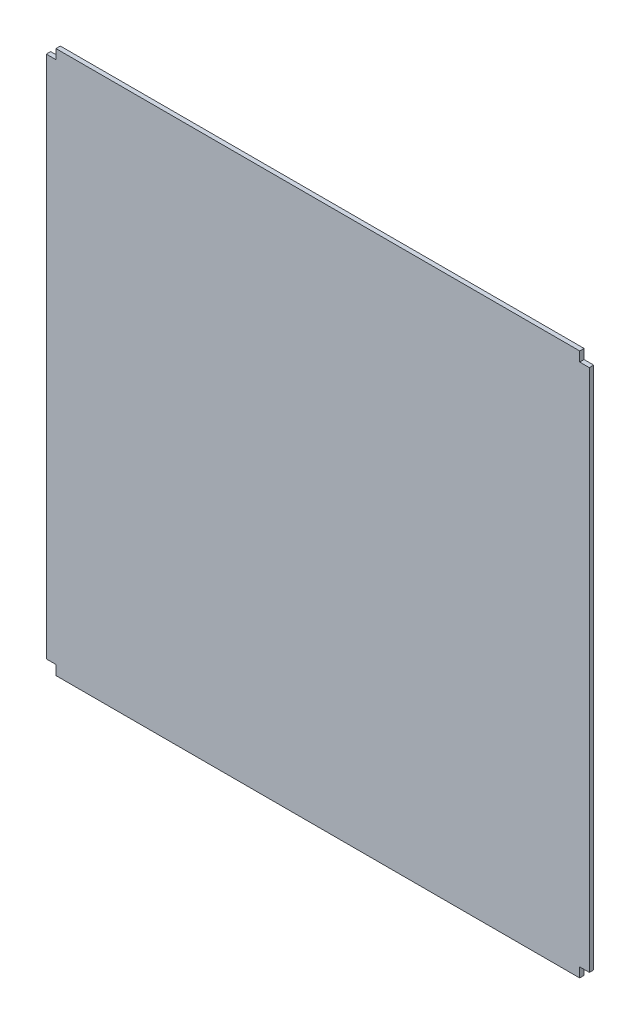
ISO-10303-21;
HEADER;
FILE_DESCRIPTION(('STEP AP214'),'2;1');
FILE_NAME('part.step','',(''),(''),'','','');
FILE_SCHEMA(('AUTOMOTIVE_DESIGN { 1 0 10303 214 1 1 1 1 }'));
ENDSEC;
DATA;
#1=APPLICATION_CONTEXT('core data for automotive mechanical design processes');
#2=APPLICATION_PROTOCOL_DEFINITION('international standard','automotive_design',2000,#1);
#3=PRODUCT_CONTEXT('',#1,'mechanical');
#4=PRODUCT('Part','Part','',(#3));
#5=PRODUCT_RELATED_PRODUCT_CATEGORY('part','',(#4));
#6=PRODUCT_DEFINITION_FORMATION('','',#4);
#7=PRODUCT_DEFINITION_CONTEXT('part definition',#1,'design');
#8=PRODUCT_DEFINITION('design','',#6,#7);
#9=PRODUCT_DEFINITION_SHAPE('','',#8);
#10=(LENGTH_UNIT() NAMED_UNIT(*) SI_UNIT(.MILLI.,.METRE.));
#11=(NAMED_UNIT(*) PLANE_ANGLE_UNIT() SI_UNIT($,.RADIAN.));
#12=(NAMED_UNIT(*) SI_UNIT($,.STERADIAN.) SOLID_ANGLE_UNIT());
#13=UNCERTAINTY_MEASURE_WITH_UNIT(LENGTH_MEASURE(1.E-05),#10,'distance_accuracy_value','');
#14=(GEOMETRIC_REPRESENTATION_CONTEXT(3) GLOBAL_UNCERTAINTY_ASSIGNED_CONTEXT((#13)) GLOBAL_UNIT_ASSIGNED_CONTEXT((#10,
#11,#12)) REPRESENTATION_CONTEXT('',''));
#15=CARTESIAN_POINT('',(0.,0.,0.));
#16=DIRECTION('',(0.,0.,1.));
#17=DIRECTION('',(1.,0.,0.));
#18=AXIS2_PLACEMENT_3D('',#15,#16,#17);
#19=CARTESIAN_POINT('',(-1.50889401983147E-12,-299.000000000002,5.));
#20=DIRECTION('',(0.,-1.,0.));
#21=DIRECTION('',(1.,0.,0.));
#22=AXIS2_PLACEMENT_3D('',#19,#20,#21);
#23=PLANE('',#22);
#24=DIRECTION('',(-1.,0.,0.));
#25=VECTOR('',#24,1.);
#26=CARTESIAN_POINT('',(-1.50889401983147E-12,-299.000000000002,0.));
#27=LINE('',#26,#25);
#28=CARTESIAN_POINT('',(-299.,-299.,0.));
#29=VERTEX_POINT('',#28);
#30=CARTESIAN_POINT('',(-310.,-299.,0.));
#31=VERTEX_POINT('',#30);
#32=EDGE_CURVE('E152',#29,#31,#27,.T.);
#33=ORIENTED_EDGE('',*,*,#32,.F.);
#34=DIRECTION('',(0.,0.,-1.));
#35=VECTOR('',#34,1.);
#36=CARTESIAN_POINT('',(-299.,-299.,5.));
#37=LINE('',#36,#35);
#38=CARTESIAN_POINT('',(-299.,-299.,5.));
#39=VERTEX_POINT('',#38);
#40=EDGE_CURVE('E11',#39,#29,#37,.T.);
#41=ORIENTED_EDGE('',*,*,#40,.F.);
#42=DIRECTION('',(-1.,0.,0.));
#43=VECTOR('',#42,1.);
#44=CARTESIAN_POINT('',(-1.50889401983147E-12,-299.000000000002,5.));
#45=LINE('',#44,#43);
#46=CARTESIAN_POINT('',(-310.,-299.,5.));
#47=VERTEX_POINT('',#46);
#48=EDGE_CURVE('E182',#39,#47,#45,.T.);
#49=ORIENTED_EDGE('',*,*,#48,.T.);
#50=DIRECTION('',(0.,0.,-1.));
#51=VECTOR('',#50,1.);
#52=CARTESIAN_POINT('',(-310.,-299.,5.));
#53=LINE('',#52,#51);
#54=EDGE_CURVE('E51',#47,#31,#53,.T.);
#55=ORIENTED_EDGE('',*,*,#54,.T.);
#56=EDGE_LOOP('',(#33,#41,#49,#55));
#57=FACE_BOUND('',#56,.T.);
#58=ADVANCED_FACE('F35',(#57),#23,.T.);
#59=CARTESIAN_POINT('',(-299.,0.,5.));
#60=DIRECTION('',(-1.,0.,0.));
#61=DIRECTION('',(0.,0.,1.));
#62=AXIS2_PLACEMENT_3D('',#59,#60,#61);
#63=PLANE('',#62);
#64=DIRECTION('',(0.,1.,0.));
#65=VECTOR('',#64,1.);
#66=CARTESIAN_POINT('',(-299.,0.,0.));
#67=LINE('',#66,#65);
#68=CARTESIAN_POINT('',(-299.,-310.,0.));
#69=VERTEX_POINT('',#68);
#70=EDGE_CURVE('E154',#69,#29,#67,.T.);
#71=ORIENTED_EDGE('',*,*,#70,.F.);
#72=DIRECTION('',(0.,0.,-1.));
#73=VECTOR('',#72,1.);
#74=CARTESIAN_POINT('',(-299.,-310.,5.));
#75=LINE('',#74,#73);
#76=CARTESIAN_POINT('',(-299.,-310.,5.));
#77=VERTEX_POINT('',#76);
#78=EDGE_CURVE('E43',#77,#69,#75,.T.);
#79=ORIENTED_EDGE('',*,*,#78,.F.);
#80=DIRECTION('',(0.,1.,0.));
#81=VECTOR('',#80,1.);
#82=CARTESIAN_POINT('',(-299.,0.,5.));
#83=LINE('',#82,#81);
#84=EDGE_CURVE('E213',#77,#39,#83,.T.);
#85=ORIENTED_EDGE('',*,*,#84,.T.);
#86=ORIENTED_EDGE('',*,*,#40,.T.);
#87=EDGE_LOOP('',(#71,#79,#85,#86));
#88=FACE_BOUND('',#87,.T.);
#89=ADVANCED_FACE('F212',(#88),#63,.T.);
#90=CARTESIAN_POINT('',(0.,-310.,5.));
#91=DIRECTION('',(0.,1.,0.));
#92=DIRECTION('',(0.,0.,1.));
#93=AXIS2_PLACEMENT_3D('',#90,#91,#92);
#94=PLANE('',#93);
#95=DIRECTION('',(1.,0.,0.));
#96=VECTOR('',#95,1.);
#97=CARTESIAN_POINT('',(0.,-310.,0.));
#98=LINE('',#97,#96);
#99=CARTESIAN_POINT('',(299.,-310.,0.));
#100=VERTEX_POINT('',#99);
#101=EDGE_CURVE('E157',#69,#100,#98,.T.);
#102=ORIENTED_EDGE('',*,*,#101,.T.);
#103=DIRECTION('',(0.,0.,-1.));
#104=VECTOR('',#103,1.);
#105=CARTESIAN_POINT('',(299.,-310.,5.));
#106=LINE('',#105,#104);
#107=CARTESIAN_POINT('',(299.,-310.,5.));
#108=VERTEX_POINT('',#107);
#109=EDGE_CURVE('E197',#108,#100,#106,.T.);
#110=ORIENTED_EDGE('',*,*,#109,.F.);
#111=DIRECTION('',(1.,0.,0.));
#112=VECTOR('',#111,1.);
#113=CARTESIAN_POINT('',(0.,-310.,5.));
#114=LINE('',#113,#112);
#115=EDGE_CURVE('E204',#77,#108,#114,.T.);
#116=ORIENTED_EDGE('',*,*,#115,.F.);
#117=ORIENTED_EDGE('',*,*,#78,.T.);
#118=EDGE_LOOP('',(#102,#110,#116,#117));
#119=FACE_BOUND('',#118,.T.);
#120=ADVANCED_FACE('F202',(#119),#94,.F.);
#121=CARTESIAN_POINT('',(299.,0.,5.));
#122=DIRECTION('',(-1.,0.,0.));
#123=DIRECTION('',(0.,0.,1.));
#124=AXIS2_PLACEMENT_3D('',#121,#122,#123);
#125=PLANE('',#124);
#126=DIRECTION('',(0.,1.,0.));
#127=VECTOR('',#126,1.);
#128=CARTESIAN_POINT('',(299.,0.,0.));
#129=LINE('',#128,#127);
#130=CARTESIAN_POINT('',(299.,-299.,0.));
#131=VERTEX_POINT('',#130);
#132=EDGE_CURVE('E159',#100,#131,#129,.T.);
#133=ORIENTED_EDGE('',*,*,#132,.T.);
#134=DIRECTION('',(0.,0.,-1.));
#135=VECTOR('',#134,1.);
#136=CARTESIAN_POINT('',(299.,-299.,5.));
#137=LINE('',#136,#135);
#138=CARTESIAN_POINT('',(299.,-299.,5.));
#139=VERTEX_POINT('',#138);
#140=EDGE_CURVE('E195',#139,#131,#137,.T.);
#141=ORIENTED_EDGE('',*,*,#140,.F.);
#142=DIRECTION('',(0.,1.,0.));
#143=VECTOR('',#142,1.);
#144=CARTESIAN_POINT('',(299.,0.,5.));
#145=LINE('',#144,#143);
#146=EDGE_CURVE('E355',#108,#139,#145,.T.);
#147=ORIENTED_EDGE('',*,*,#146,.F.);
#148=ORIENTED_EDGE('',*,*,#109,.T.);
#149=EDGE_LOOP('',(#133,#141,#147,#148));
#150=FACE_BOUND('',#149,.T.);
#151=ADVANCED_FACE('F231',(#150),#125,.F.);
#152=CARTESIAN_POINT('',(0.,-299.,5.));
#153=DIRECTION('',(0.,-1.,0.));
#154=DIRECTION('',(0.,0.,-1.));
#155=AXIS2_PLACEMENT_3D('',#152,#153,#154);
#156=PLANE('',#155);
#157=DIRECTION('',(-1.,0.,0.));
#158=VECTOR('',#157,1.);
#159=CARTESIAN_POINT('',(0.,-299.,0.));
#160=LINE('',#159,#158);
#161=CARTESIAN_POINT('',(310.,-299.,0.));
#162=VERTEX_POINT('',#161);
#163=EDGE_CURVE('E162',#162,#131,#160,.T.);
#164=ORIENTED_EDGE('',*,*,#163,.F.);
#165=DIRECTION('',(0.,0.,-1.));
#166=VECTOR('',#165,1.);
#167=CARTESIAN_POINT('',(310.,-299.,5.));
#168=LINE('',#167,#166);
#169=CARTESIAN_POINT('',(310.,-299.,5.));
#170=VERTEX_POINT('',#169);
#171=EDGE_CURVE('E193',#170,#162,#168,.T.);
#172=ORIENTED_EDGE('',*,*,#171,.F.);
#173=DIRECTION('',(-1.,0.,0.));
#174=VECTOR('',#173,1.);
#175=CARTESIAN_POINT('',(0.,-299.,5.));
#176=LINE('',#175,#174);
#177=EDGE_CURVE('E353',#170,#139,#176,.T.);
#178=ORIENTED_EDGE('',*,*,#177,.T.);
#179=ORIENTED_EDGE('',*,*,#140,.T.);
#180=EDGE_LOOP('',(#164,#172,#178,#179));
#181=FACE_BOUND('',#180,.T.);
#182=ADVANCED_FACE('F236',(#181),#156,.T.);
#183=CARTESIAN_POINT('',(310.,0.,5.));
#184=DIRECTION('',(-1.,0.,0.));
#185=DIRECTION('',(0.,0.,1.));
#186=AXIS2_PLACEMENT_3D('',#183,#184,#185);
#187=PLANE('',#186);
#188=DIRECTION('',(0.,1.,0.));
#189=VECTOR('',#188,1.);
#190=CARTESIAN_POINT('',(310.,0.,0.));
#191=LINE('',#190,#189);
#192=CARTESIAN_POINT('',(310.,299.,0.));
#193=VERTEX_POINT('',#192);
#194=EDGE_CURVE('E165',#162,#193,#191,.T.);
#195=ORIENTED_EDGE('',*,*,#194,.T.);
#196=DIRECTION('',(0.,0.,-1.));
#197=VECTOR('',#196,1.);
#198=CARTESIAN_POINT('',(310.,299.,5.));
#199=LINE('',#198,#197);
#200=CARTESIAN_POINT('',(310.,299.,5.));
#201=VERTEX_POINT('',#200);
#202=EDGE_CURVE('E190',#201,#193,#199,.T.);
#203=ORIENTED_EDGE('',*,*,#202,.F.);
#204=DIRECTION('',(0.,1.,0.));
#205=VECTOR('',#204,1.);
#206=CARTESIAN_POINT('',(310.,0.,5.));
#207=LINE('',#206,#205);
#208=EDGE_CURVE('E348',#170,#201,#207,.T.);
#209=ORIENTED_EDGE('',*,*,#208,.F.);
#210=ORIENTED_EDGE('',*,*,#171,.T.);
#211=EDGE_LOOP('',(#195,#203,#209,#210));
#212=FACE_BOUND('',#211,.T.);
#213=ADVANCED_FACE('F240',(#212),#187,.F.);
#214=CARTESIAN_POINT('',(0.,299.,5.));
#215=DIRECTION('',(0.,-1.,0.));
#216=DIRECTION('',(0.,0.,-1.));
#217=AXIS2_PLACEMENT_3D('',#214,#215,#216);
#218=PLANE('',#217);
#219=DIRECTION('',(-1.,0.,0.));
#220=VECTOR('',#219,1.);
#221=CARTESIAN_POINT('',(0.,299.,0.));
#222=LINE('',#221,#220);
#223=CARTESIAN_POINT('',(299.,299.,0.));
#224=VERTEX_POINT('',#223);
#225=EDGE_CURVE('E167',#193,#224,#222,.T.);
#226=ORIENTED_EDGE('',*,*,#225,.T.);
#227=DIRECTION('',(0.,0.,-1.));
#228=VECTOR('',#227,1.);
#229=CARTESIAN_POINT('',(299.,299.,5.));
#230=LINE('',#229,#228);
#231=CARTESIAN_POINT('',(299.,299.,5.));
#232=VERTEX_POINT('',#231);
#233=EDGE_CURVE('E188',#232,#224,#230,.T.);
#234=ORIENTED_EDGE('',*,*,#233,.F.);
#235=DIRECTION('',(-1.,0.,0.));
#236=VECTOR('',#235,1.);
#237=CARTESIAN_POINT('',(0.,299.,5.));
#238=LINE('',#237,#236);
#239=EDGE_CURVE('E346',#201,#232,#238,.T.);
#240=ORIENTED_EDGE('',*,*,#239,.F.);
#241=ORIENTED_EDGE('',*,*,#202,.T.);
#242=EDGE_LOOP('',(#226,#234,#240,#241));
#243=FACE_BOUND('',#242,.T.);
#244=ADVANCED_FACE('F244',(#243),#218,.F.);
#245=CARTESIAN_POINT('',(299.,0.,5.));
#246=DIRECTION('',(1.,0.,0.));
#247=DIRECTION('',(0.,0.,-1.));
#248=AXIS2_PLACEMENT_3D('',#245,#246,#247);
#249=PLANE('',#248);
#250=DIRECTION('',(0.,-1.,0.));
#251=VECTOR('',#250,1.);
#252=CARTESIAN_POINT('',(299.,0.,0.));
#253=LINE('',#252,#251);
#254=CARTESIAN_POINT('',(299.,310.,0.));
#255=VERTEX_POINT('',#254);
#256=EDGE_CURVE('E170',#255,#224,#253,.T.);
#257=ORIENTED_EDGE('',*,*,#256,.F.);
#258=DIRECTION('',(0.,0.,-1.));
#259=VECTOR('',#258,1.);
#260=CARTESIAN_POINT('',(299.,310.,5.));
#261=LINE('',#260,#259);
#262=CARTESIAN_POINT('',(299.,310.,5.));
#263=VERTEX_POINT('',#262);
#264=EDGE_CURVE('E186',#263,#255,#261,.T.);
#265=ORIENTED_EDGE('',*,*,#264,.F.);
#266=DIRECTION('',(0.,-1.,0.));
#267=VECTOR('',#266,1.);
#268=CARTESIAN_POINT('',(299.,0.,5.));
#269=LINE('',#268,#267);
#270=EDGE_CURVE('E343',#263,#232,#269,.T.);
#271=ORIENTED_EDGE('',*,*,#270,.T.);
#272=ORIENTED_EDGE('',*,*,#233,.T.);
#273=EDGE_LOOP('',(#257,#265,#271,#272));
#274=FACE_BOUND('',#273,.T.);
#275=ADVANCED_FACE('F248',(#274),#249,.T.);
#276=CARTESIAN_POINT('',(0.,310.,5.));
#277=DIRECTION('',(0.,1.,0.));
#278=DIRECTION('',(0.,0.,1.));
#279=AXIS2_PLACEMENT_3D('',#276,#277,#278);
#280=PLANE('',#279);
#281=DIRECTION('',(1.,0.,0.));
#282=VECTOR('',#281,1.);
#283=CARTESIAN_POINT('',(0.,310.,0.));
#284=LINE('',#283,#282);
#285=CARTESIAN_POINT('',(-299.,310.,0.));
#286=VERTEX_POINT('',#285);
#287=EDGE_CURVE('E173',#286,#255,#284,.T.);
#288=ORIENTED_EDGE('',*,*,#287,.F.);
#289=DIRECTION('',(0.,0.,-1.));
#290=VECTOR('',#289,1.);
#291=CARTESIAN_POINT('',(-299.,310.,5.));
#292=LINE('',#291,#290);
#293=CARTESIAN_POINT('',(-299.,310.,5.));
#294=VERTEX_POINT('',#293);
#295=EDGE_CURVE('E144',#294,#286,#292,.T.);
#296=ORIENTED_EDGE('',*,*,#295,.F.);
#297=DIRECTION('',(1.,0.,0.));
#298=VECTOR('',#297,1.);
#299=CARTESIAN_POINT('',(0.,310.,5.));
#300=LINE('',#299,#298);
#301=EDGE_CURVE('E134',#294,#263,#300,.T.);
#302=ORIENTED_EDGE('',*,*,#301,.T.);
#303=ORIENTED_EDGE('',*,*,#264,.T.);
#304=EDGE_LOOP('',(#288,#296,#302,#303));
#305=FACE_BOUND('',#304,.T.);
#306=ADVANCED_FACE('F252',(#305),#280,.T.);
#307=CARTESIAN_POINT('',(-299.,0.,5.));
#308=DIRECTION('',(1.,0.,0.));
#309=DIRECTION('',(0.,0.,-1.));
#310=AXIS2_PLACEMENT_3D('',#307,#308,#309);
#311=PLANE('',#310);
#312=DIRECTION('',(0.,-1.,0.));
#313=VECTOR('',#312,1.);
#314=CARTESIAN_POINT('',(-299.,0.,0.));
#315=LINE('',#314,#313);
#316=CARTESIAN_POINT('',(-299.,299.,0.));
#317=VERTEX_POINT('',#316);
#318=EDGE_CURVE('E141',#286,#317,#315,.T.);
#319=ORIENTED_EDGE('',*,*,#318,.T.);
#320=DIRECTION('',(0.,0.,-1.));
#321=VECTOR('',#320,1.);
#322=CARTESIAN_POINT('',(-299.,299.,5.));
#323=LINE('',#322,#321);
#324=CARTESIAN_POINT('',(-299.,299.,5.));
#325=VERTEX_POINT('',#324);
#326=EDGE_CURVE('E138',#325,#317,#323,.T.);
#327=ORIENTED_EDGE('',*,*,#326,.F.);
#328=DIRECTION('',(0.,-1.,0.));
#329=VECTOR('',#328,1.);
#330=CARTESIAN_POINT('',(-299.,0.,5.));
#331=LINE('',#330,#329);
#332=EDGE_CURVE('E126',#294,#325,#331,.T.);
#333=ORIENTED_EDGE('',*,*,#332,.F.);
#334=ORIENTED_EDGE('',*,*,#295,.T.);
#335=EDGE_LOOP('',(#319,#327,#333,#334));
#336=FACE_BOUND('',#335,.T.);
#337=ADVANCED_FACE('F139',(#336),#311,.F.);
#338=CARTESIAN_POINT('',(0.,299.,5.));
#339=DIRECTION('',(0.,-1.,0.));
#340=DIRECTION('',(0.,0.,-1.));
#341=AXIS2_PLACEMENT_3D('',#338,#339,#340);
#342=PLANE('',#341);
#343=DIRECTION('',(-1.,0.,0.));
#344=VECTOR('',#343,1.);
#345=CARTESIAN_POINT('',(0.,299.,0.));
#346=LINE('',#345,#344);
#347=CARTESIAN_POINT('',(-310.,299.,0.));
#348=VERTEX_POINT('',#347);
#349=EDGE_CURVE('E177',#317,#348,#346,.T.);
#350=ORIENTED_EDGE('',*,*,#349,.T.);
#351=DIRECTION('',(0.,0.,-1.));
#352=VECTOR('',#351,1.);
#353=CARTESIAN_POINT('',(-310.,299.,5.));
#354=LINE('',#353,#352);
#355=CARTESIAN_POINT('',(-310.,299.,5.));
#356=VERTEX_POINT('',#355);
#357=EDGE_CURVE('E89',#356,#348,#354,.T.);
#358=ORIENTED_EDGE('',*,*,#357,.F.);
#359=DIRECTION('',(-1.,0.,0.));
#360=VECTOR('',#359,1.);
#361=CARTESIAN_POINT('',(0.,299.,5.));
#362=LINE('',#361,#360);
#363=EDGE_CURVE('E131',#325,#356,#362,.T.);
#364=ORIENTED_EDGE('',*,*,#363,.F.);
#365=ORIENTED_EDGE('',*,*,#326,.T.);
#366=EDGE_LOOP('',(#350,#358,#364,#365));
#367=FACE_BOUND('',#366,.T.);
#368=ADVANCED_FACE('F146',(#367),#342,.F.);
#369=CARTESIAN_POINT('',(-310.,0.,5.));
#370=DIRECTION('',(-1.,0.,0.));
#371=DIRECTION('',(0.,0.,1.));
#372=AXIS2_PLACEMENT_3D('',#369,#370,#371);
#373=PLANE('',#372);
#374=DIRECTION('',(0.,1.,0.));
#375=VECTOR('',#374,1.);
#376=CARTESIAN_POINT('',(-310.,0.,0.));
#377=LINE('',#376,#375);
#378=EDGE_CURVE('E179',#31,#348,#377,.T.);
#379=ORIENTED_EDGE('',*,*,#378,.F.);
#380=ORIENTED_EDGE('',*,*,#54,.F.);
#381=DIRECTION('',(0.,1.,0.));
#382=VECTOR('',#381,1.);
#383=CARTESIAN_POINT('',(-310.,0.,5.));
#384=LINE('',#383,#382);
#385=EDGE_CURVE('E147',#47,#356,#384,.T.);
#386=ORIENTED_EDGE('',*,*,#385,.T.);
#387=ORIENTED_EDGE('',*,*,#357,.T.);
#388=EDGE_LOOP('',(#379,#380,#386,#387));
#389=FACE_BOUND('',#388,.T.);
#390=ADVANCED_FACE('F214',(#389),#373,.T.);
#391=CARTESIAN_POINT('',(0.,0.,5.));
#392=DIRECTION('',(0.,0.,1.));
#393=DIRECTION('',(1.,0.,0.));
#394=AXIS2_PLACEMENT_3D('',#391,#392,#393);
#395=PLANE('',#394);
#396=ORIENTED_EDGE('',*,*,#48,.F.);
#397=ORIENTED_EDGE('',*,*,#84,.F.);
#398=ORIENTED_EDGE('',*,*,#115,.T.);
#399=ORIENTED_EDGE('',*,*,#146,.T.);
#400=ORIENTED_EDGE('',*,*,#177,.F.);
#401=ORIENTED_EDGE('',*,*,#208,.T.);
#402=ORIENTED_EDGE('',*,*,#239,.T.);
#403=ORIENTED_EDGE('',*,*,#270,.F.);
#404=ORIENTED_EDGE('',*,*,#301,.F.);
#405=ORIENTED_EDGE('',*,*,#332,.T.);
#406=ORIENTED_EDGE('',*,*,#363,.T.);
#407=ORIENTED_EDGE('',*,*,#385,.F.);
#408=EDGE_LOOP('',(#396,#397,#398,#399,#400,#401,#402,#403,#404,#405,#406,#407));
#409=FACE_BOUND('',#408,.T.);
#410=ADVANCED_FACE('F128',(#409),#395,.T.);
#411=CARTESIAN_POINT('',(0.,0.,0.));
#412=DIRECTION('',(0.,0.,1.));
#413=DIRECTION('',(1.,0.,0.));
#414=AXIS2_PLACEMENT_3D('',#411,#412,#413);
#415=PLANE('',#414);
#416=ORIENTED_EDGE('',*,*,#32,.T.);
#417=ORIENTED_EDGE('',*,*,#378,.T.);
#418=ORIENTED_EDGE('',*,*,#349,.F.);
#419=ORIENTED_EDGE('',*,*,#318,.F.);
#420=ORIENTED_EDGE('',*,*,#287,.T.);
#421=ORIENTED_EDGE('',*,*,#256,.T.);
#422=ORIENTED_EDGE('',*,*,#225,.F.);
#423=ORIENTED_EDGE('',*,*,#194,.F.);
#424=ORIENTED_EDGE('',*,*,#163,.T.);
#425=ORIENTED_EDGE('',*,*,#132,.F.);
#426=ORIENTED_EDGE('',*,*,#101,.F.);
#427=ORIENTED_EDGE('',*,*,#70,.T.);
#428=EDGE_LOOP('',(#416,#417,#418,#419,#420,#421,#422,#423,#424,#425,#426,#427));
#429=FACE_BOUND('',#428,.T.);
#430=ADVANCED_FACE('F211',(#429),#415,.F.);
#431=CLOSED_SHELL('',(#58,#89,#120,#151,#182,#213,#244,#275,#306,#337,#368,#390,#410,#430));
#432=MANIFOLD_SOLID_BREP('B2',#431);
#433=ADVANCED_BREP_SHAPE_REPRESENTATION('',(#18,#432),#14);
#434=SHAPE_DEFINITION_REPRESENTATION(#9,#433);
ENDSEC;
END-ISO-10303-21;
